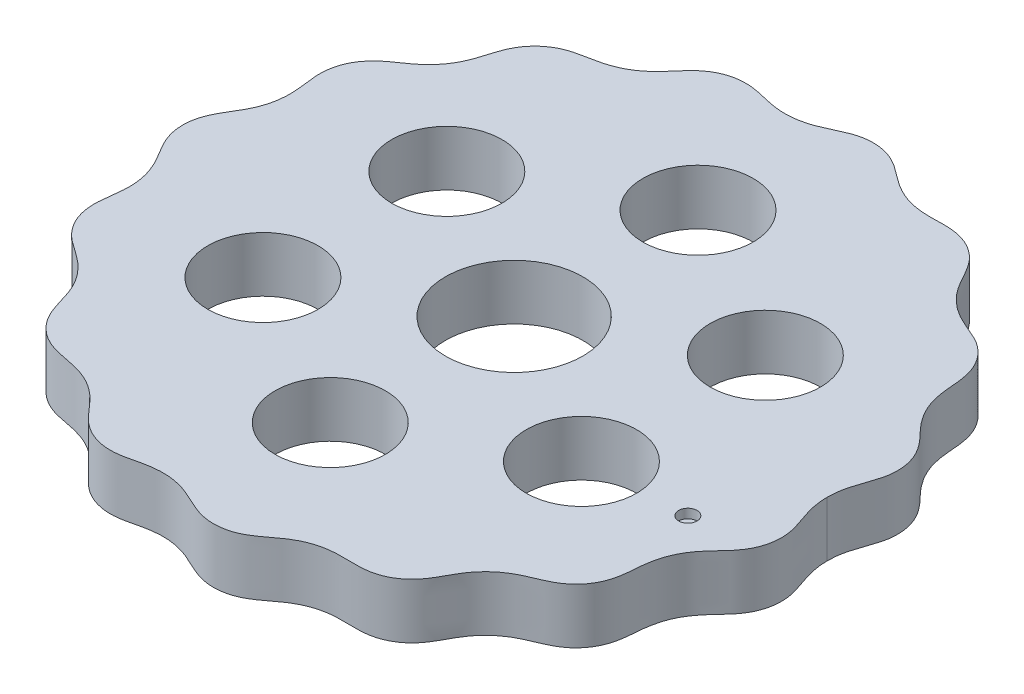
ISO-10303-21;
HEADER;
FILE_DESCRIPTION(('STEP AP214'),'2;1');
FILE_NAME('part.step','',(''),(''),'','','');
FILE_SCHEMA(('AUTOMOTIVE_DESIGN { 1 0 10303 214 1 1 1 1 }'));
ENDSEC;
DATA;
#1=APPLICATION_CONTEXT('core data for automotive mechanical design processes');
#2=APPLICATION_PROTOCOL_DEFINITION('international standard','automotive_design',2000,#1);
#3=PRODUCT_CONTEXT('',#1,'mechanical');
#4=PRODUCT('Part','Part','',(#3));
#5=PRODUCT_RELATED_PRODUCT_CATEGORY('part','',(#4));
#6=PRODUCT_DEFINITION_FORMATION('','',#4);
#7=PRODUCT_DEFINITION_CONTEXT('part definition',#1,'design');
#8=PRODUCT_DEFINITION('design','',#6,#7);
#9=PRODUCT_DEFINITION_SHAPE('','',#8);
#10=(LENGTH_UNIT() NAMED_UNIT(*) SI_UNIT(.MILLI.,.METRE.));
#11=(NAMED_UNIT(*) PLANE_ANGLE_UNIT() SI_UNIT($,.RADIAN.));
#12=(NAMED_UNIT(*) SI_UNIT($,.STERADIAN.) SOLID_ANGLE_UNIT());
#13=UNCERTAINTY_MEASURE_WITH_UNIT(LENGTH_MEASURE(1.E-05),#10,'distance_accuracy_value','');
#14=(GEOMETRIC_REPRESENTATION_CONTEXT(3) GLOBAL_UNCERTAINTY_ASSIGNED_CONTEXT((#13)) GLOBAL_UNIT_ASSIGNED_CONTEXT((#10,
#11,#12)) REPRESENTATION_CONTEXT('',''));
#15=CARTESIAN_POINT('',(0.,0.,0.));
#16=DIRECTION('',(0.,0.,1.));
#17=DIRECTION('',(1.,0.,0.));
#18=AXIS2_PLACEMENT_3D('',#15,#16,#17);
#19=CARTESIAN_POINT('',(-35.05,6.,-6.79447580960355E-13));
#20=CARTESIAN_POINT('',(-35.0500000000082,6.,0.601878761066767));
#21=CARTESIAN_POINT('',(-34.8553368029908,6.,1.81785079318405));
#22=CARTESIAN_POINT('',(-34.0120354721509,6.,3.43122980614223));
#23=CARTESIAN_POINT('',(-33.0335892363206,6.,4.93469078102037));
#24=CARTESIAN_POINT('',(-32.3517418708775,6.,6.59786117170244));
#25=CARTESIAN_POINT('',(-32.0757754971569,6.,8.37582766727421));
#26=CARTESIAN_POINT('',(-32.2049831799162,6.,10.1635179830055));
#27=CARTESIAN_POINT('',(-32.4979162012587,6.,11.9453935120308));
#28=CARTESIAN_POINT('',(-32.3457918337506,6.,13.7734509022175));
#29=CARTESIAN_POINT('',(-31.6155427163027,6.,15.4611393343524));
#30=CARTESIAN_POINT('',(-30.3879451238262,6.,16.8259176088963));
#31=CARTESIAN_POINT('',(-28.8726076271398,6.,17.8118803077543));
#32=CARTESIAN_POINT('',(-27.4434246094749,6.,18.8926486784884));
#33=CARTESIAN_POINT('',(-26.2849706751593,6.,20.269271473643));
#34=CARTESIAN_POINT('',(-25.4804410915177,6.,21.877479040722));
#35=CARTESIAN_POINT('',(-25.0056239563869,6.,23.6053486951235));
#36=CARTESIAN_POINT('',(-24.2011714079101,6.,25.8969589223933));
#37=CARTESIAN_POINT('',(-22.342794246026,6.,27.6504260297273));
#38=CARTESIAN_POINT('',(-19.9963563228629,6.,28.2983181895648));
#39=CARTESIAN_POINT('',(-18.2225137558597,6.,28.5671554070339));
#40=CARTESIAN_POINT('',(-16.5216437126037,6.,29.1475096030051));
#41=CARTESIAN_POINT('',(-15.0003772117141,6.,30.1081805796954));
#42=CARTESIAN_POINT('',(-13.7402024320431,6.,31.3837399153797));
#43=CARTESIAN_POINT('',(-12.6200769233239,6.,32.7974342125205));
#44=CARTESIAN_POINT('',(-11.1856343968467,6.,33.9385608734676));
#45=CARTESIAN_POINT('',(-9.45536171372532,6.,34.561863227018));
#46=CARTESIAN_POINT('',(-7.61907713212827,6.,34.6037655655048));
#47=CARTESIAN_POINT('',(-5.86627955103491,6.,34.1520112914151));
#48=CARTESIAN_POINT('',(-4.11223072361709,6.,33.789925987407));
#49=CARTESIAN_POINT('',(-2.3131542028763,6.,33.8221367498476));
#50=CARTESIAN_POINT('',(-0.572152538924218,6.,34.2736511028803));
#51=CARTESIAN_POINT('',(1.03579759565262,6.,35.0636998466422));
#52=CARTESIAN_POINT('',(2.70292921033807,6.,35.7895233494753));
#53=CARTESIAN_POINT('',(4.53328198678685,6.,35.9699050699175));
#54=CARTESIAN_POINT('',(6.32792326930641,6.,35.5664714343398));
#55=CARTESIAN_POINT('',(7.8873583875661,6.,34.6160917155494));
#56=CARTESIAN_POINT('',(9.27045661149057,6.,33.4702715747717));
#57=CARTESIAN_POINT('',(10.8258684579298,6.,32.571684343228));
#58=CARTESIAN_POINT('',(12.5497470426253,6.,32.056592442879));
#59=CARTESIAN_POINT('',(14.3403811437014,6.,31.9481438554672));
#60=CARTESIAN_POINT('',(16.138162859529,6.,32.0666998191716));
#61=CARTESIAN_POINT('',(17.9506188601929,6.,31.804064636253));
#62=CARTESIAN_POINT('',(19.5893345540055,6.,30.9697358445862));
#63=CARTESIAN_POINT('',(20.8793460191054,6.,29.6605139564718));
#64=CARTESIAN_POINT('',(21.7348969350553,6.,28.063477735684));
#65=CARTESIAN_POINT('',(22.9112517707044,6.,25.9835895461088));
#66=CARTESIAN_POINT('',(24.7570576623988,6.,24.3803877932754));
#67=CARTESIAN_POINT('',(26.9684972061444,6.,23.4758048940795));
#68=CARTESIAN_POINT('',(28.6321107295983,6.,22.7474902589853));
#69=CARTESIAN_POINT('',(30.0177309343962,6.,21.5384719803996));
#70=CARTESIAN_POINT('',(30.9526112904732,6.,19.9544631603976));
#71=CARTESIAN_POINT('',(31.3265352888142,6.,18.1655890312164));
#72=CARTESIAN_POINT('',(31.3965653967204,6.,16.3684571472859));
#73=CARTESIAN_POINT('',(31.7429571440484,6.,14.6069888472455));
#74=CARTESIAN_POINT('',(32.4877066627943,6.,12.9692487651538));
#75=CARTESIAN_POINT('',(33.5854700618532,6.,11.5493162041953));
#76=CARTESIAN_POINT('',(34.8762951439563,6.,10.2952756532867));
#77=CARTESIAN_POINT('',(35.9254904949993,6.,8.79622363953039));
#78=CARTESIAN_POINT('',(36.4395745060293,6.,7.03029588676672));
#79=CARTESIAN_POINT('',(36.3706563927939,6.,5.19330738123071));
#80=CARTESIAN_POINT('',(35.7745737883189,6.,3.47963326476361));
#81=CARTESIAN_POINT('',(35.1913465120437,6.,1.78711982704152));
#82=CARTESIAN_POINT('',(35.0499999999448,6.,0.59419871205814));
#83=CARTESIAN_POINT('',(35.05,6.,4.64495072061561E-12));
#84=B_SPLINE_CURVE_WITH_KNOTS('',3,(#19,#20,#21,#22,#23,#24,#25,#26,#27,#28,#29,#30,#31,#32,#33,
#34,#35,#36,#37,#38,#39,#40,#41,#42,#43,#44,#45,#46,#47,#48,#49,#50,#51,#52,#53,#54,#55,#56,#57,
#58,#59,#60,#61,#62,#63,#64,#65,#66,#67,#68,#69,#70,#71,#72,#73,#74,#75,#76,#77,#78,#79,#80,#81,
#82,#83),.UNSPECIFIED.,.F.,.F.,(4,1,1,1,1,1,1,1,1,1,1,1,1,1,1,1,1,1,1,1,1,1,1,1,1,1,1,1,1,1,1,1,
1,1,1,1,1,1,1,1,1,1,1,1,1,1,1,1,1,1,1,1,1,1,1,1,1,1,1,1,1,1,4),(0.0723695662334952,
0.0856649243269337,0.0989602824203721,0.112255640513811,0.125550998607249,0.138846356700688,
0.152141714794126,0.165437072887564,0.178732430981003,0.192027789074441,0.20532314716788,
0.218618505261318,0.231913863354757,0.245209221448195,0.258504579541634,0.271799937635072,
0.285095295728511,0.311686011915388,0.324981370008826,0.338276728102265,0.351572086195703,
0.364867444289141,0.37816280238258,0.391458160476018,0.404753518569457,0.418048876662895,
0.431344234756334,0.444639592849772,0.457934950943211,0.471230309036649,0.484525667130088,
0.497821025223526,0.511116383316965,0.524411741410403,0.537707099503842,0.55100245759728,
0.564297815690718,0.577593173784157,0.590888531877595,0.604183889971034,0.617479248064472,
0.630774606157911,0.644069964251349,0.657365322344788,0.670660680438226,0.683956038531665,
0.710546754718542,0.72384211281198,0.737137470905418,0.750432828998857,0.763728187092295,
0.777023545185734,0.790318903279172,0.803614261372611,0.816909619466049,0.830204977559488,
0.843500335652926,0.856795693746365,0.870091051839803,0.883386409933242,0.89668176802668,
0.909977126120118,0.923272484213557),.UNSPECIFIED.);
#85=DIRECTION('',(0.,-1.,0.));
#86=VECTOR('',#85,1.);
#87=SURFACE_OF_LINEAR_EXTRUSION('',#84,#86);
#88=CARTESIAN_POINT('',(-35.05,0.,-6.79447580960355E-13));
#89=CARTESIAN_POINT('',(-35.0500000000082,0.,0.601878761066767));
#90=CARTESIAN_POINT('',(-34.8553368029908,0.,1.81785079318405));
#91=CARTESIAN_POINT('',(-34.0120354721509,0.,3.43122980614223));
#92=CARTESIAN_POINT('',(-33.0335892363206,0.,4.93469078102037));
#93=CARTESIAN_POINT('',(-32.3517418708775,0.,6.59786117170244));
#94=CARTESIAN_POINT('',(-32.0757754971569,0.,8.37582766727421));
#95=CARTESIAN_POINT('',(-32.2049831799162,0.,10.1635179830055));
#96=CARTESIAN_POINT('',(-32.4979162012587,0.,11.9453935120308));
#97=CARTESIAN_POINT('',(-32.3457918337506,0.,13.7734509022175));
#98=CARTESIAN_POINT('',(-31.6155427163027,0.,15.4611393343524));
#99=CARTESIAN_POINT('',(-30.3879451238262,0.,16.8259176088963));
#100=CARTESIAN_POINT('',(-28.8726076271398,0.,17.8118803077543));
#101=CARTESIAN_POINT('',(-27.4434246094749,0.,18.8926486784884));
#102=CARTESIAN_POINT('',(-26.2849706751593,0.,20.269271473643));
#103=CARTESIAN_POINT('',(-25.4804410915177,0.,21.877479040722));
#104=CARTESIAN_POINT('',(-25.0056239563869,0.,23.6053486951235));
#105=CARTESIAN_POINT('',(-24.2011714079101,0.,25.8969589223933));
#106=CARTESIAN_POINT('',(-22.342794246026,0.,27.6504260297273));
#107=CARTESIAN_POINT('',(-19.9963563228629,0.,28.2983181895648));
#108=CARTESIAN_POINT('',(-18.2225137558597,0.,28.5671554070339));
#109=CARTESIAN_POINT('',(-16.5216437126037,0.,29.1475096030051));
#110=CARTESIAN_POINT('',(-15.0003772117141,0.,30.1081805796954));
#111=CARTESIAN_POINT('',(-13.7402024320431,0.,31.3837399153797));
#112=CARTESIAN_POINT('',(-12.6200769233239,0.,32.7974342125205));
#113=CARTESIAN_POINT('',(-11.1856343968467,0.,33.9385608734676));
#114=CARTESIAN_POINT('',(-9.45536171372532,0.,34.561863227018));
#115=CARTESIAN_POINT('',(-7.61907713212827,0.,34.6037655655048));
#116=CARTESIAN_POINT('',(-5.86627955103491,0.,34.1520112914151));
#117=CARTESIAN_POINT('',(-4.11223072361709,0.,33.789925987407));
#118=CARTESIAN_POINT('',(-2.3131542028763,0.,33.8221367498476));
#119=CARTESIAN_POINT('',(-0.572152538924218,0.,34.2736511028803));
#120=CARTESIAN_POINT('',(1.03579759565262,0.,35.0636998466422));
#121=CARTESIAN_POINT('',(2.70292921033807,0.,35.7895233494753));
#122=CARTESIAN_POINT('',(4.53328198678685,0.,35.9699050699175));
#123=CARTESIAN_POINT('',(6.32792326930641,0.,35.5664714343398));
#124=CARTESIAN_POINT('',(7.8873583875661,0.,34.6160917155494));
#125=CARTESIAN_POINT('',(9.27045661149057,0.,33.4702715747717));
#126=CARTESIAN_POINT('',(10.8258684579298,0.,32.571684343228));
#127=CARTESIAN_POINT('',(12.5497470426253,0.,32.056592442879));
#128=CARTESIAN_POINT('',(14.3403811437014,0.,31.9481438554672));
#129=CARTESIAN_POINT('',(16.138162859529,0.,32.0666998191716));
#130=CARTESIAN_POINT('',(17.9506188601929,0.,31.804064636253));
#131=CARTESIAN_POINT('',(19.5893345540055,0.,30.9697358445862));
#132=CARTESIAN_POINT('',(20.8793460191054,0.,29.6605139564718));
#133=CARTESIAN_POINT('',(21.7348969350553,0.,28.063477735684));
#134=CARTESIAN_POINT('',(22.9112517707044,0.,25.9835895461088));
#135=CARTESIAN_POINT('',(24.7570576623988,0.,24.3803877932754));
#136=CARTESIAN_POINT('',(26.9684972061444,0.,23.4758048940795));
#137=CARTESIAN_POINT('',(28.6321107295983,0.,22.7474902589853));
#138=CARTESIAN_POINT('',(30.0177309343962,0.,21.5384719803996));
#139=CARTESIAN_POINT('',(30.9526112904732,0.,19.9544631603976));
#140=CARTESIAN_POINT('',(31.3265352888142,0.,18.1655890312164));
#141=CARTESIAN_POINT('',(31.3965653967204,0.,16.3684571472859));
#142=CARTESIAN_POINT('',(31.7429571440484,0.,14.6069888472455));
#143=CARTESIAN_POINT('',(32.4877066627943,0.,12.9692487651538));
#144=CARTESIAN_POINT('',(33.5854700618532,0.,11.5493162041953));
#145=CARTESIAN_POINT('',(34.8762951439563,0.,10.2952756532867));
#146=CARTESIAN_POINT('',(35.9254904949993,0.,8.79622363953039));
#147=CARTESIAN_POINT('',(36.4395745060293,0.,7.03029588676672));
#148=CARTESIAN_POINT('',(36.3706563927939,0.,5.19330738123071));
#149=CARTESIAN_POINT('',(35.7745737883189,0.,3.47963326476361));
#150=CARTESIAN_POINT('',(35.1913465120437,0.,1.78711982704152));
#151=CARTESIAN_POINT('',(35.0499999999448,0.,0.59419871205814));
#152=CARTESIAN_POINT('',(35.05,0.,4.64495072061561E-12));
#153=B_SPLINE_CURVE_WITH_KNOTS('',3,(#88,#89,#90,#91,#92,#93,#94,#95,#96,#97,#98,#99,#100,#101,
#102,#103,#104,#105,#106,#107,#108,#109,#110,#111,#112,#113,#114,#115,#116,#117,#118,#119,#120,
#121,#122,#123,#124,#125,#126,#127,#128,#129,#130,#131,#132,#133,#134,#135,#136,#137,#138,#139,
#140,#141,#142,#143,#144,#145,#146,#147,#148,#149,#150,#151,#152),.UNSPECIFIED.,.F.,.F.,(4,1,1,
1,1,1,1,1,1,1,1,1,1,1,1,1,1,1,1,1,1,1,1,1,1,1,1,1,1,1,1,1,1,1,1,1,1,1,1,1,1,1,1,1,1,1,1,1,1,1,1,
1,1,1,1,1,1,1,1,1,1,1,4),(0.0723695662334952,0.0856649243269337,0.0989602824203721,
0.112255640513811,0.125550998607249,0.138846356700688,0.152141714794126,0.165437072887564,
0.178732430981003,0.192027789074441,0.20532314716788,0.218618505261318,0.231913863354757,
0.245209221448195,0.258504579541634,0.271799937635072,0.285095295728511,0.311686011915388,
0.324981370008826,0.338276728102265,0.351572086195703,0.364867444289141,0.37816280238258,
0.391458160476018,0.404753518569457,0.418048876662895,0.431344234756334,0.444639592849772,
0.457934950943211,0.471230309036649,0.484525667130088,0.497821025223526,0.511116383316965,
0.524411741410403,0.537707099503842,0.55100245759728,0.564297815690718,0.577593173784157,
0.590888531877595,0.604183889971034,0.617479248064472,0.630774606157911,0.644069964251349,
0.657365322344788,0.670660680438226,0.683956038531665,0.710546754718542,0.72384211281198,
0.737137470905418,0.750432828998857,0.763728187092295,0.777023545185734,0.790318903279172,
0.803614261372611,0.816909619466049,0.830204977559488,0.843500335652926,0.856795693746365,
0.870091051839803,0.883386409933242,0.89668176802668,0.909977126120118,0.923272484213557),.UNSPECIFIED.);
#154=CARTESIAN_POINT('',(-35.05,0.,1.36507195783586E-12));
#155=VERTEX_POINT('',#154);
#156=CARTESIAN_POINT('',(35.05,0.,-9.32696218690507E-12));
#157=VERTEX_POINT('',#156);
#158=EDGE_CURVE('E71',#155,#157,#153,.T.);
#159=ORIENTED_EDGE('',*,*,#158,.T.);
#160=DIRECTION('',(0.,-1.,0.));
#161=VECTOR('',#160,1.);
#162=CARTESIAN_POINT('',(35.05,6.,-9.32696218690507E-12));
#163=LINE('',#162,#161);
#164=CARTESIAN_POINT('',(35.05,6.,-9.32696218690507E-12));
#165=VERTEX_POINT('',#164);
#166=EDGE_CURVE('E11',#165,#157,#163,.T.);
#167=ORIENTED_EDGE('',*,*,#166,.F.);
#168=CARTESIAN_POINT('',(-35.05,6.,1.36507195783586E-12));
#169=VERTEX_POINT('',#168);
#170=EDGE_CURVE('E70',#169,#165,#84,.T.);
#171=ORIENTED_EDGE('',*,*,#170,.F.);
#172=DIRECTION('',(0.,-1.,0.));
#173=VECTOR('',#172,1.);
#174=CARTESIAN_POINT('',(-35.05,6.,1.36507195783586E-12));
#175=LINE('',#174,#173);
#176=EDGE_CURVE('E48',#169,#155,#175,.T.);
#177=ORIENTED_EDGE('',*,*,#176,.T.);
#178=EDGE_LOOP('',(#159,#167,#171,#177));
#179=FACE_BOUND('',#178,.T.);
#180=ADVANCED_FACE('F39',(#179),#87,.F.);
#181=CARTESIAN_POINT('',(35.05,6.,-9.32696218690507E-12));
#182=CARTESIAN_POINT('',(35.0499999998892,6.,-0.594198712220902));
#183=CARTESIAN_POINT('',(35.1913465120562,6.,-1.78711982767264));
#184=CARTESIAN_POINT('',(35.7745737882899,6.,-3.47963326521063));
#185=CARTESIAN_POINT('',(36.3706563927621,6.,-5.19330738173192));
#186=CARTESIAN_POINT('',(36.4395745059833,6.,-7.03029588725489));
#187=CARTESIAN_POINT('',(35.9254904949425,6.,-8.79622364001885));
#188=CARTESIAN_POINT('',(34.8762951438896,6.,-10.2952756537674));
#189=CARTESIAN_POINT('',(33.5854700617785,6.,-11.5493162046679));
#190=CARTESIAN_POINT('',(32.4877066627104,6.,-12.9692487656192));
#191=CARTESIAN_POINT('',(31.7429571439539,6.,-14.6069888477062));
#192=CARTESIAN_POINT('',(31.3965653966145,6.,-16.3684571477443));
#193=CARTESIAN_POINT('',(31.3265352886967,6.,-18.1655890316743));
#194=CARTESIAN_POINT('',(30.9526112903441,6.,-19.9544631608531));
#195=CARTESIAN_POINT('',(30.0177309342568,6.,-21.5384719808491));
#196=CARTESIAN_POINT('',(28.6321107294511,6.,-22.7474902594258));
#197=CARTESIAN_POINT('',(26.9684972059925,6.,-23.4758048945092));
#198=CARTESIAN_POINT('',(24.7570576622411,6.,-24.3803877936909));
#199=CARTESIAN_POINT('',(22.9112517705363,6.,-25.9835895465123));
#200=CARTESIAN_POINT('',(21.7348969348737,6.,-28.0634777360799));
#201=CARTESIAN_POINT('',(20.8793460189135,6.,-29.6605139568622));
#202=CARTESIAN_POINT('',(19.5893345538051,6.,-30.9697358449682));
#203=CARTESIAN_POINT('',(17.9506188599872,6.,-31.8040646366244));
#204=CARTESIAN_POINT('',(16.1381628593216,6.,-32.0666998195313));
#205=CARTESIAN_POINT('',(14.3403811434947,6.,-31.9481438558153));
#206=CARTESIAN_POINT('',(12.5497470424179,6.,-32.0565924432155));
#207=CARTESIAN_POINT('',(10.825868457719,6.,-32.5716843435534));
#208=CARTESIAN_POINT('',(9.27045661127405,6.,-33.470271575087));
#209=CARTESIAN_POINT('',(7.88735838734217,6.,-34.6160917158558));
#210=CARTESIAN_POINT('',(6.32792326907634,6.,-35.566471434636));
#211=CARTESIAN_POINT('',(4.53328198655416,6.,-35.9699050702021));
#212=CARTESIAN_POINT('',(2.70292921010655,6.,-35.7895233497481));
#213=CARTESIAN_POINT('',(1.0357975954258,6.,-35.0636998469043));
#214=CARTESIAN_POINT('',(-0.572152539145931,6.,-34.2736511031319));
#215=CARTESIAN_POINT('',(-2.3131542030951,6.,-33.822136750088));
#216=CARTESIAN_POINT('',(-4.11223072383567,6.,-33.7899259876357));
#217=CARTESIAN_POINT('',(-5.86627955125583,6.,-34.1520112916324));
#218=CARTESIAN_POINT('',(-7.61907713235212,6.,-34.6037655657108));
#219=CARTESIAN_POINT('',(-9.4553617139489,6.,-34.5618632272122));
#220=CARTESIAN_POINT('',(-11.1856343970663,6.,-33.9385608736506));
#221=CARTESIAN_POINT('',(-12.6200769235361,6.,-32.7974342126942));
#222=CARTESIAN_POINT('',(-13.7402024322461,6.,-31.3837399155461));
#223=CARTESIAN_POINT('',(-15.0003772119089,6.,-30.1081805798537));
#224=CARTESIAN_POINT('',(-16.5216437127923,6.,-29.1475096031536));
#225=CARTESIAN_POINT('',(-18.2225137560445,6.,-28.5671554071713));
#226=CARTESIAN_POINT('',(-19.996356323046,6.,-28.2983181896908));
#227=CARTESIAN_POINT('',(-22.3427942462048,6.,-27.6504260298381));
#228=CARTESIAN_POINT('',(-24.2011714080776,6.,-25.896958922492));
#229=CARTESIAN_POINT('',(-25.0056239565396,6.,-23.6053486952171));
#230=CARTESIAN_POINT('',(-25.4804410916592,6.,-21.8774790408125));
#231=CARTESIAN_POINT('',(-26.2849706752904,6.,-20.2692714737283));
#232=CARTESIAN_POINT('',(-27.4434246095971,6.,-18.8926486785662));
#233=CARTESIAN_POINT('',(-28.8726076272551,6.,-17.8118803078229));
#234=CARTESIAN_POINT('',(-30.3879451239351,6.,-16.825917608955));
#235=CARTESIAN_POINT('',(-31.6155427164027,6.,-15.4611393344032));
#236=CARTESIAN_POINT('',(-32.3457918338397,6.,-13.7734509022635));
#237=CARTESIAN_POINT('',(-32.497916201336,6.,-11.945393512076));
#238=CARTESIAN_POINT('',(-32.204983179982,6.,-10.1635179830524));
#239=CARTESIAN_POINT('',(-32.0757754972111,6.,-8.37582766732209));
#240=CARTESIAN_POINT('',(-32.3517418709203,6.,-6.59786117174831));
#241=CARTESIAN_POINT('',(-33.0335892363524,6.,-4.93469078106266));
#242=CARTESIAN_POINT('',(-34.0120354721736,6.,-3.43122980617509));
#243=CARTESIAN_POINT('',(-34.8553368030006,6.,-1.81785079322302));
#244=CARTESIAN_POINT('',(-35.0500000000164,6.,-0.601878761075716));
#245=CARTESIAN_POINT('',(-35.05,6.,1.36507195783586E-12));
#246=B_SPLINE_CURVE_WITH_KNOTS('',3,(#181,#182,#183,#184,#185,#186,#187,#188,#189,#190,#191,
#192,#193,#194,#195,#196,#197,#198,#199,#200,#201,#202,#203,#204,#205,#206,#207,#208,#209,#210,
#211,#212,#213,#214,#215,#216,#217,#218,#219,#220,#221,#222,#223,#224,#225,#226,#227,#228,#229,
#230,#231,#232,#233,#234,#235,#236,#237,#238,#239,#240,#241,#242,#243,#244,#245),.UNSPECIFIED.,
.F.,.F.,(4,1,1,1,1,1,1,1,1,1,1,1,1,1,1,1,1,1,1,1,1,1,1,1,1,1,1,1,1,1,1,1,1,1,1,1,1,1,1,1,1,1,1,
1,1,1,1,1,1,1,1,1,1,1,1,1,1,1,1,1,1,1,4),(0.0723695662334952,0.0856649243269337,
0.0989602824203721,0.112255640513811,0.125550998607249,0.138846356700688,0.152141714794126,
0.165437072887564,0.178732430981003,0.192027789074441,0.20532314716788,0.218618505261318,
0.231913863354757,0.245209221448195,0.258504579541634,0.271799937635072,0.285095295728511,
0.311686011915388,0.324981370008826,0.338276728102265,0.351572086195703,0.364867444289141,
0.37816280238258,0.391458160476018,0.404753518569457,0.418048876662895,0.431344234756334,
0.444639592849772,0.457934950943211,0.471230309036649,0.484525667130088,0.497821025223526,
0.511116383316965,0.524411741410403,0.537707099503842,0.55100245759728,0.564297815690718,
0.577593173784157,0.590888531877595,0.604183889971034,0.617479248064472,0.630774606157911,
0.644069964251349,0.657365322344788,0.670660680438226,0.683956038531665,0.710546754718541,
0.72384211281198,0.737137470905418,0.750432828998857,0.763728187092295,0.777023545185734,
0.790318903279172,0.803614261372611,0.816909619466049,0.830204977559488,0.843500335652926,
0.856795693746365,0.870091051839803,0.883386409933242,0.89668176802668,0.909977126120118,
0.923272484213557),.UNSPECIFIED.);
#247=DIRECTION('',(0.,-1.,0.));
#248=VECTOR('',#247,1.);
#249=SURFACE_OF_LINEAR_EXTRUSION('',#246,#248);
#250=CARTESIAN_POINT('',(35.05,0.,-9.32696218690507E-12));
#251=CARTESIAN_POINT('',(35.0499999998892,0.,-0.594198712220902));
#252=CARTESIAN_POINT('',(35.1913465120562,0.,-1.78711982767264));
#253=CARTESIAN_POINT('',(35.7745737882899,0.,-3.47963326521063));
#254=CARTESIAN_POINT('',(36.3706563927621,0.,-5.19330738173192));
#255=CARTESIAN_POINT('',(36.4395745059833,0.,-7.03029588725489));
#256=CARTESIAN_POINT('',(35.9254904949425,0.,-8.79622364001885));
#257=CARTESIAN_POINT('',(34.8762951438896,0.,-10.2952756537674));
#258=CARTESIAN_POINT('',(33.5854700617785,0.,-11.5493162046679));
#259=CARTESIAN_POINT('',(32.4877066627104,0.,-12.9692487656192));
#260=CARTESIAN_POINT('',(31.7429571439539,0.,-14.6069888477062));
#261=CARTESIAN_POINT('',(31.3965653966145,0.,-16.3684571477443));
#262=CARTESIAN_POINT('',(31.3265352886967,0.,-18.1655890316743));
#263=CARTESIAN_POINT('',(30.9526112903441,0.,-19.9544631608531));
#264=CARTESIAN_POINT('',(30.0177309342568,0.,-21.5384719808491));
#265=CARTESIAN_POINT('',(28.6321107294511,0.,-22.7474902594258));
#266=CARTESIAN_POINT('',(26.9684972059925,0.,-23.4758048945092));
#267=CARTESIAN_POINT('',(24.7570576622411,0.,-24.3803877936909));
#268=CARTESIAN_POINT('',(22.9112517705363,0.,-25.9835895465123));
#269=CARTESIAN_POINT('',(21.7348969348737,0.,-28.0634777360799));
#270=CARTESIAN_POINT('',(20.8793460189135,0.,-29.6605139568622));
#271=CARTESIAN_POINT('',(19.5893345538051,0.,-30.9697358449682));
#272=CARTESIAN_POINT('',(17.9506188599872,0.,-31.8040646366244));
#273=CARTESIAN_POINT('',(16.1381628593216,0.,-32.0666998195313));
#274=CARTESIAN_POINT('',(14.3403811434947,0.,-31.9481438558153));
#275=CARTESIAN_POINT('',(12.5497470424179,0.,-32.0565924432155));
#276=CARTESIAN_POINT('',(10.825868457719,0.,-32.5716843435534));
#277=CARTESIAN_POINT('',(9.27045661127405,0.,-33.470271575087));
#278=CARTESIAN_POINT('',(7.88735838734217,0.,-34.6160917158558));
#279=CARTESIAN_POINT('',(6.32792326907634,0.,-35.566471434636));
#280=CARTESIAN_POINT('',(4.53328198655416,0.,-35.9699050702021));
#281=CARTESIAN_POINT('',(2.70292921010655,0.,-35.7895233497481));
#282=CARTESIAN_POINT('',(1.0357975954258,0.,-35.0636998469043));
#283=CARTESIAN_POINT('',(-0.572152539145931,0.,-34.2736511031319));
#284=CARTESIAN_POINT('',(-2.3131542030951,0.,-33.822136750088));
#285=CARTESIAN_POINT('',(-4.11223072383567,0.,-33.7899259876357));
#286=CARTESIAN_POINT('',(-5.86627955125583,0.,-34.1520112916324));
#287=CARTESIAN_POINT('',(-7.61907713235212,0.,-34.6037655657108));
#288=CARTESIAN_POINT('',(-9.4553617139489,0.,-34.5618632272122));
#289=CARTESIAN_POINT('',(-11.1856343970663,0.,-33.9385608736506));
#290=CARTESIAN_POINT('',(-12.6200769235361,0.,-32.7974342126942));
#291=CARTESIAN_POINT('',(-13.7402024322461,0.,-31.3837399155461));
#292=CARTESIAN_POINT('',(-15.0003772119089,0.,-30.1081805798537));
#293=CARTESIAN_POINT('',(-16.5216437127923,0.,-29.1475096031536));
#294=CARTESIAN_POINT('',(-18.2225137560445,0.,-28.5671554071713));
#295=CARTESIAN_POINT('',(-19.996356323046,0.,-28.2983181896908));
#296=CARTESIAN_POINT('',(-22.3427942462048,0.,-27.6504260298381));
#297=CARTESIAN_POINT('',(-24.2011714080776,0.,-25.896958922492));
#298=CARTESIAN_POINT('',(-25.0056239565396,0.,-23.6053486952171));
#299=CARTESIAN_POINT('',(-25.4804410916592,0.,-21.8774790408125));
#300=CARTESIAN_POINT('',(-26.2849706752904,0.,-20.2692714737283));
#301=CARTESIAN_POINT('',(-27.4434246095971,0.,-18.8926486785662));
#302=CARTESIAN_POINT('',(-28.8726076272551,0.,-17.8118803078229));
#303=CARTESIAN_POINT('',(-30.3879451239351,0.,-16.825917608955));
#304=CARTESIAN_POINT('',(-31.6155427164027,0.,-15.4611393344032));
#305=CARTESIAN_POINT('',(-32.3457918338397,0.,-13.7734509022635));
#306=CARTESIAN_POINT('',(-32.497916201336,0.,-11.945393512076));
#307=CARTESIAN_POINT('',(-32.204983179982,0.,-10.1635179830524));
#308=CARTESIAN_POINT('',(-32.0757754972111,0.,-8.37582766732209));
#309=CARTESIAN_POINT('',(-32.3517418709203,0.,-6.59786117174831));
#310=CARTESIAN_POINT('',(-33.0335892363524,0.,-4.93469078106266));
#311=CARTESIAN_POINT('',(-34.0120354721736,0.,-3.43122980617509));
#312=CARTESIAN_POINT('',(-34.8553368030006,0.,-1.81785079322302));
#313=CARTESIAN_POINT('',(-35.0500000000164,0.,-0.601878761075716));
#314=CARTESIAN_POINT('',(-35.05,0.,1.36507195783586E-12));
#315=B_SPLINE_CURVE_WITH_KNOTS('',3,(#250,#251,#252,#253,#254,#255,#256,#257,#258,#259,#260,
#261,#262,#263,#264,#265,#266,#267,#268,#269,#270,#271,#272,#273,#274,#275,#276,#277,#278,#279,
#280,#281,#282,#283,#284,#285,#286,#287,#288,#289,#290,#291,#292,#293,#294,#295,#296,#297,#298,
#299,#300,#301,#302,#303,#304,#305,#306,#307,#308,#309,#310,#311,#312,#313,#314),.UNSPECIFIED.,
.F.,.F.,(4,1,1,1,1,1,1,1,1,1,1,1,1,1,1,1,1,1,1,1,1,1,1,1,1,1,1,1,1,1,1,1,1,1,1,1,1,1,1,1,1,1,1,
1,1,1,1,1,1,1,1,1,1,1,1,1,1,1,1,1,1,1,4),(0.0723695662334952,0.0856649243269337,
0.0989602824203721,0.112255640513811,0.125550998607249,0.138846356700688,0.152141714794126,
0.165437072887564,0.178732430981003,0.192027789074441,0.20532314716788,0.218618505261318,
0.231913863354757,0.245209221448195,0.258504579541634,0.271799937635072,0.285095295728511,
0.311686011915388,0.324981370008826,0.338276728102265,0.351572086195703,0.364867444289141,
0.37816280238258,0.391458160476018,0.404753518569457,0.418048876662895,0.431344234756334,
0.444639592849772,0.457934950943211,0.471230309036649,0.484525667130088,0.497821025223526,
0.511116383316965,0.524411741410403,0.537707099503842,0.55100245759728,0.564297815690718,
0.577593173784157,0.590888531877595,0.604183889971034,0.617479248064472,0.630774606157911,
0.644069964251349,0.657365322344788,0.670660680438226,0.683956038531665,0.710546754718541,
0.72384211281198,0.737137470905418,0.750432828998857,0.763728187092295,0.777023545185734,
0.790318903279172,0.803614261372611,0.816909619466049,0.830204977559488,0.843500335652926,
0.856795693746365,0.870091051839803,0.883386409933242,0.89668176802668,0.909977126120118,
0.923272484213557),.UNSPECIFIED.);
#316=EDGE_CURVE('E63',#157,#155,#315,.T.);
#317=ORIENTED_EDGE('',*,*,#316,.T.);
#318=ORIENTED_EDGE('',*,*,#176,.F.);
#319=EDGE_CURVE('E55',#165,#169,#246,.T.);
#320=ORIENTED_EDGE('',*,*,#319,.F.);
#321=ORIENTED_EDGE('',*,*,#166,.T.);
#322=EDGE_LOOP('',(#317,#318,#320,#321));
#323=FACE_BOUND('',#322,.T.);
#324=ADVANCED_FACE('F66',(#323),#249,.F.);
#325=CARTESIAN_POINT('',(1.04566117567072,6.,35.0529956398208));
#326=DIRECTION('',(0.,-1.,0.));
#327=DIRECTION('',(0.,0.,-1.));
#328=AXIS2_PLACEMENT_3D('',#325,#326,#327);
#329=PLANE('',#328);
#330=CARTESIAN_POINT('',(29.2200048934011,6.,9.32717297087158));
#331=DIRECTION('',(0.,1.,0.));
#332=DIRECTION('',(0.,0.,1.));
#333=AXIS2_PLACEMENT_3D('',#330,#331,#332);
#334=CIRCLE('',#333,1.);
#335=CARTESIAN_POINT('',(29.2200048934011,6.,10.3271729708716));
#336=VERTEX_POINT('',#335);
#337=EDGE_CURVE('E228',#336,#336,#334,.T.);
#338=ORIENTED_EDGE('',*,*,#337,.F.);
#339=EDGE_LOOP('',(#338));
#340=FACE_BOUND('',#339,.T.);
#341=CARTESIAN_POINT('',(-16.3205080756888,6.,-10.));
#342=DIRECTION('',(0.,1.,0.));
#343=DIRECTION('',(0.,0.,1.));
#344=AXIS2_PLACEMENT_3D('',#341,#342,#343);
#345=CIRCLE('',#344,6.);
#346=CARTESIAN_POINT('',(-16.3205080756888,6.,-4.));
#347=VERTEX_POINT('',#346);
#348=EDGE_CURVE('E231',#347,#347,#345,.T.);
#349=ORIENTED_EDGE('',*,*,#348,.F.);
#350=EDGE_LOOP('',(#349));
#351=FACE_BOUND('',#350,.T.);
#352=CARTESIAN_POINT('',(-16.3205080756888,6.,10.));
#353=DIRECTION('',(0.,1.,0.));
#354=DIRECTION('',(0.,0.,1.));
#355=AXIS2_PLACEMENT_3D('',#352,#353,#354);
#356=CIRCLE('',#355,6.);
#357=CARTESIAN_POINT('',(-16.3205080756888,6.,16.));
#358=VERTEX_POINT('',#357);
#359=EDGE_CURVE('E260',#358,#358,#356,.T.);
#360=ORIENTED_EDGE('',*,*,#359,.F.);
#361=EDGE_LOOP('',(#360));
#362=FACE_BOUND('',#361,.T.);
#363=CARTESIAN_POINT('',(1.,6.,20.));
#364=DIRECTION('',(0.,1.,0.));
#365=DIRECTION('',(0.,0.,1.));
#366=AXIS2_PLACEMENT_3D('',#363,#364,#365);
#367=CIRCLE('',#366,6.00000000000001);
#368=CARTESIAN_POINT('',(1.,6.,26.));
#369=VERTEX_POINT('',#368);
#370=EDGE_CURVE('E254',#369,#369,#367,.T.);
#371=ORIENTED_EDGE('',*,*,#370,.F.);
#372=EDGE_LOOP('',(#371));
#373=FACE_BOUND('',#372,.T.);
#374=CARTESIAN_POINT('',(18.3205080756888,6.,10.));
#375=DIRECTION('',(0.,1.,0.));
#376=DIRECTION('',(0.,0.,1.));
#377=AXIS2_PLACEMENT_3D('',#374,#375,#376);
#378=CIRCLE('',#377,6.00000000000001);
#379=CARTESIAN_POINT('',(18.3205080756888,6.,16.));
#380=VERTEX_POINT('',#379);
#381=EDGE_CURVE('E248',#380,#380,#378,.T.);
#382=ORIENTED_EDGE('',*,*,#381,.F.);
#383=EDGE_LOOP('',(#382));
#384=FACE_BOUND('',#383,.T.);
#385=CARTESIAN_POINT('',(18.3205080756888,6.,-10.));
#386=DIRECTION('',(0.,1.,0.));
#387=DIRECTION('',(0.,0.,1.));
#388=AXIS2_PLACEMENT_3D('',#385,#386,#387);
#389=CIRCLE('',#388,6.);
#390=CARTESIAN_POINT('',(18.3205080756888,6.,-4.));
#391=VERTEX_POINT('',#390);
#392=EDGE_CURVE('E242',#391,#391,#389,.T.);
#393=ORIENTED_EDGE('',*,*,#392,.F.);
#394=EDGE_LOOP('',(#393));
#395=FACE_BOUND('',#394,.T.);
#396=CARTESIAN_POINT('',(0.999999999999997,6.,-20.));
#397=DIRECTION('',(0.,1.,0.));
#398=DIRECTION('',(0.,0.,1.));
#399=AXIS2_PLACEMENT_3D('',#396,#397,#398);
#400=CIRCLE('',#399,6.);
#401=CARTESIAN_POINT('',(0.999999999999997,6.,-14.));
#402=VERTEX_POINT('',#401);
#403=EDGE_CURVE('E236',#402,#402,#400,.T.);
#404=ORIENTED_EDGE('',*,*,#403,.F.);
#405=EDGE_LOOP('',(#404));
#406=FACE_BOUND('',#405,.T.);
#407=CARTESIAN_POINT('',(0.999999999999997,6.,0.));
#408=DIRECTION('',(0.,1.,0.));
#409=DIRECTION('',(0.,0.,1.));
#410=AXIS2_PLACEMENT_3D('',#407,#408,#409);
#411=CIRCLE('',#410,7.475);
#412=CARTESIAN_POINT('',(0.999999999999997,6.,7.475));
#413=VERTEX_POINT('',#412);
#414=EDGE_CURVE('E78',#413,#413,#411,.T.);
#415=ORIENTED_EDGE('',*,*,#414,.F.);
#416=EDGE_LOOP('',(#415));
#417=FACE_BOUND('',#416,.T.);
#418=ORIENTED_EDGE('',*,*,#170,.T.);
#419=ORIENTED_EDGE('',*,*,#319,.T.);
#420=EDGE_LOOP('',(#418,#419));
#421=FACE_BOUND('',#420,.T.);
#422=ADVANCED_FACE('F103',(#340,#351,#362,#373,#384,#395,#406,#417,#421),#329,.F.);
#423=CARTESIAN_POINT('',(1.04566117567072,0.,35.0529956398208));
#424=DIRECTION('',(0.,-1.,0.));
#425=DIRECTION('',(0.,0.,-1.));
#426=AXIS2_PLACEMENT_3D('',#423,#424,#425);
#427=PLANE('',#426);
#428=CARTESIAN_POINT('',(-16.3205080756888,0.,-10.));
#429=DIRECTION('',(0.,1.,0.));
#430=DIRECTION('',(0.,0.,1.));
#431=AXIS2_PLACEMENT_3D('',#428,#429,#430);
#432=CIRCLE('',#431,6.);
#433=CARTESIAN_POINT('',(-16.3205080756888,0.,-4.));
#434=VERTEX_POINT('',#433);
#435=EDGE_CURVE('E227',#434,#434,#432,.T.);
#436=ORIENTED_EDGE('',*,*,#435,.T.);
#437=EDGE_LOOP('',(#436));
#438=FACE_BOUND('',#437,.T.);
#439=CARTESIAN_POINT('',(-16.3205080756888,0.,10.));
#440=DIRECTION('',(0.,1.,0.));
#441=DIRECTION('',(0.,0.,1.));
#442=AXIS2_PLACEMENT_3D('',#439,#440,#441);
#443=CIRCLE('',#442,6.);
#444=CARTESIAN_POINT('',(-16.3205080756888,0.,16.));
#445=VERTEX_POINT('',#444);
#446=EDGE_CURVE('E263',#445,#445,#443,.T.);
#447=ORIENTED_EDGE('',*,*,#446,.T.);
#448=EDGE_LOOP('',(#447));
#449=FACE_BOUND('',#448,.T.);
#450=CARTESIAN_POINT('',(1.,0.,20.));
#451=DIRECTION('',(0.,1.,0.));
#452=DIRECTION('',(0.,0.,1.));
#453=AXIS2_PLACEMENT_3D('',#450,#451,#452);
#454=CIRCLE('',#453,6.00000000000001);
#455=CARTESIAN_POINT('',(1.,0.,26.));
#456=VERTEX_POINT('',#455);
#457=EDGE_CURVE('E257',#456,#456,#454,.T.);
#458=ORIENTED_EDGE('',*,*,#457,.T.);
#459=EDGE_LOOP('',(#458));
#460=FACE_BOUND('',#459,.T.);
#461=CARTESIAN_POINT('',(18.3205080756888,0.,10.));
#462=DIRECTION('',(0.,1.,0.));
#463=DIRECTION('',(0.,0.,1.));
#464=AXIS2_PLACEMENT_3D('',#461,#462,#463);
#465=CIRCLE('',#464,6.00000000000001);
#466=CARTESIAN_POINT('',(18.3205080756888,0.,16.));
#467=VERTEX_POINT('',#466);
#468=EDGE_CURVE('E251',#467,#467,#465,.T.);
#469=ORIENTED_EDGE('',*,*,#468,.T.);
#470=EDGE_LOOP('',(#469));
#471=FACE_BOUND('',#470,.T.);
#472=CARTESIAN_POINT('',(18.3205080756888,0.,-10.));
#473=DIRECTION('',(0.,1.,0.));
#474=DIRECTION('',(0.,0.,1.));
#475=AXIS2_PLACEMENT_3D('',#472,#473,#474);
#476=CIRCLE('',#475,6.);
#477=CARTESIAN_POINT('',(18.3205080756888,0.,-4.));
#478=VERTEX_POINT('',#477);
#479=EDGE_CURVE('E245',#478,#478,#476,.T.);
#480=ORIENTED_EDGE('',*,*,#479,.T.);
#481=EDGE_LOOP('',(#480));
#482=FACE_BOUND('',#481,.T.);
#483=CARTESIAN_POINT('',(0.999999999999997,0.,-20.));
#484=DIRECTION('',(0.,1.,0.));
#485=DIRECTION('',(0.,0.,1.));
#486=AXIS2_PLACEMENT_3D('',#483,#484,#485);
#487=CIRCLE('',#486,6.);
#488=CARTESIAN_POINT('',(0.999999999999997,0.,-14.));
#489=VERTEX_POINT('',#488);
#490=EDGE_CURVE('E239',#489,#489,#487,.T.);
#491=ORIENTED_EDGE('',*,*,#490,.T.);
#492=EDGE_LOOP('',(#491));
#493=FACE_BOUND('',#492,.T.);
#494=CARTESIAN_POINT('',(0.999999999999997,0.,0.));
#495=DIRECTION('',(0.,1.,0.));
#496=DIRECTION('',(0.,0.,1.));
#497=AXIS2_PLACEMENT_3D('',#494,#495,#496);
#498=CIRCLE('',#497,7.475);
#499=CARTESIAN_POINT('',(0.999999999999997,0.,7.475));
#500=VERTEX_POINT('',#499);
#501=EDGE_CURVE('E75',#500,#500,#498,.T.);
#502=ORIENTED_EDGE('',*,*,#501,.T.);
#503=EDGE_LOOP('',(#502));
#504=FACE_BOUND('',#503,.T.);
#505=ORIENTED_EDGE('',*,*,#158,.F.);
#506=ORIENTED_EDGE('',*,*,#316,.F.);
#507=EDGE_LOOP('',(#505,#506));
#508=FACE_BOUND('',#507,.T.);
#509=ADVANCED_FACE('F74',(#438,#449,#460,#471,#482,#493,#504,#508),#427,.T.);
#510=CARTESIAN_POINT('',(0.999999999999997,0.,0.));
#511=DIRECTION('',(0.,1.,0.));
#512=DIRECTION('',(0.,0.,1.));
#513=AXIS2_PLACEMENT_3D('',#510,#511,#512);
#514=CYLINDRICAL_SURFACE('',#513,7.475);
#515=ORIENTED_EDGE('',*,*,#501,.F.);
#516=EDGE_LOOP('',(#515));
#517=FACE_BOUND('',#516,.T.);
#518=ORIENTED_EDGE('',*,*,#414,.T.);
#519=EDGE_LOOP('',(#518));
#520=FACE_BOUND('',#519,.T.);
#521=ADVANCED_FACE('F106',(#517,#520),#514,.F.);
#522=CARTESIAN_POINT('',(0.999999999999997,0.,-20.));
#523=DIRECTION('',(0.,1.,0.));
#524=DIRECTION('',(0.,0.,1.));
#525=AXIS2_PLACEMENT_3D('',#522,#523,#524);
#526=CYLINDRICAL_SURFACE('',#525,6.);
#527=ORIENTED_EDGE('',*,*,#490,.F.);
#528=EDGE_LOOP('',(#527));
#529=FACE_BOUND('',#528,.T.);
#530=ORIENTED_EDGE('',*,*,#403,.T.);
#531=EDGE_LOOP('',(#530));
#532=FACE_BOUND('',#531,.T.);
#533=ADVANCED_FACE('F113',(#529,#532),#526,.F.);
#534=CARTESIAN_POINT('',(18.3205080756888,0.,-10.));
#535=DIRECTION('',(0.,1.,0.));
#536=DIRECTION('',(0.,0.,1.));
#537=AXIS2_PLACEMENT_3D('',#534,#535,#536);
#538=CYLINDRICAL_SURFACE('',#537,6.);
#539=ORIENTED_EDGE('',*,*,#479,.F.);
#540=EDGE_LOOP('',(#539));
#541=FACE_BOUND('',#540,.T.);
#542=ORIENTED_EDGE('',*,*,#392,.T.);
#543=EDGE_LOOP('',(#542));
#544=FACE_BOUND('',#543,.T.);
#545=ADVANCED_FACE('F131',(#541,#544),#538,.F.);
#546=CARTESIAN_POINT('',(18.3205080756888,0.,10.));
#547=DIRECTION('',(0.,1.,0.));
#548=DIRECTION('',(0.,0.,1.));
#549=AXIS2_PLACEMENT_3D('',#546,#547,#548);
#550=CYLINDRICAL_SURFACE('',#549,6.00000000000001);
#551=ORIENTED_EDGE('',*,*,#468,.F.);
#552=EDGE_LOOP('',(#551));
#553=FACE_BOUND('',#552,.T.);
#554=ORIENTED_EDGE('',*,*,#381,.T.);
#555=EDGE_LOOP('',(#554));
#556=FACE_BOUND('',#555,.T.);
#557=ADVANCED_FACE('F127',(#553,#556),#550,.F.);
#558=CARTESIAN_POINT('',(1.,0.,20.));
#559=DIRECTION('',(0.,1.,0.));
#560=DIRECTION('',(0.,0.,1.));
#561=AXIS2_PLACEMENT_3D('',#558,#559,#560);
#562=CYLINDRICAL_SURFACE('',#561,6.00000000000001);
#563=ORIENTED_EDGE('',*,*,#457,.F.);
#564=EDGE_LOOP('',(#563));
#565=FACE_BOUND('',#564,.T.);
#566=ORIENTED_EDGE('',*,*,#370,.T.);
#567=EDGE_LOOP('',(#566));
#568=FACE_BOUND('',#567,.T.);
#569=ADVANCED_FACE('F123',(#565,#568),#562,.F.);
#570=CARTESIAN_POINT('',(-16.3205080756888,0.,10.));
#571=DIRECTION('',(0.,1.,0.));
#572=DIRECTION('',(0.,0.,1.));
#573=AXIS2_PLACEMENT_3D('',#570,#571,#572);
#574=CYLINDRICAL_SURFACE('',#573,6.);
#575=ORIENTED_EDGE('',*,*,#446,.F.);
#576=EDGE_LOOP('',(#575));
#577=FACE_BOUND('',#576,.T.);
#578=ORIENTED_EDGE('',*,*,#359,.T.);
#579=EDGE_LOOP('',(#578));
#580=FACE_BOUND('',#579,.T.);
#581=ADVANCED_FACE('F119',(#577,#580),#574,.F.);
#582=CARTESIAN_POINT('',(-16.3205080756888,0.,-10.));
#583=DIRECTION('',(0.,1.,0.));
#584=DIRECTION('',(0.,0.,1.));
#585=AXIS2_PLACEMENT_3D('',#582,#583,#584);
#586=CYLINDRICAL_SURFACE('',#585,6.);
#587=ORIENTED_EDGE('',*,*,#435,.F.);
#588=EDGE_LOOP('',(#587));
#589=FACE_BOUND('',#588,.T.);
#590=ORIENTED_EDGE('',*,*,#348,.T.);
#591=EDGE_LOOP('',(#590));
#592=FACE_BOUND('',#591,.T.);
#593=ADVANCED_FACE('F115',(#589,#592),#586,.F.);
#594=CARTESIAN_POINT('',(29.2200048934011,5.,9.32717297087158));
#595=DIRECTION('',(0.,1.,0.));
#596=DIRECTION('',(0.,0.,1.));
#597=AXIS2_PLACEMENT_3D('',#594,#595,#596);
#598=CYLINDRICAL_SURFACE('',#597,1.);
#599=CARTESIAN_POINT('',(29.2200048934011,5.,9.32717297087158));
#600=DIRECTION('',(0.,1.,0.));
#601=DIRECTION('',(0.,0.,1.));
#602=AXIS2_PLACEMENT_3D('',#599,#600,#601);
#603=CIRCLE('',#602,1.);
#604=CARTESIAN_POINT('',(29.2200048934011,5.,10.3271729708716));
#605=VERTEX_POINT('',#604);
#606=EDGE_CURVE('E226',#605,#605,#603,.T.);
#607=ORIENTED_EDGE('',*,*,#606,.F.);
#608=EDGE_LOOP('',(#607));
#609=FACE_BOUND('',#608,.T.);
#610=ORIENTED_EDGE('',*,*,#337,.T.);
#611=EDGE_LOOP('',(#610));
#612=FACE_BOUND('',#611,.T.);
#613=ADVANCED_FACE('F118',(#609,#612),#598,.F.);
#614=CARTESIAN_POINT('',(29.2200048934011,5.,9.32717297087158));
#615=DIRECTION('',(0.,1.,0.));
#616=DIRECTION('',(0.,0.,1.));
#617=AXIS2_PLACEMENT_3D('',#614,#615,#616);
#618=PLANE('',#617);
#619=ORIENTED_EDGE('',*,*,#606,.T.);
#620=EDGE_LOOP('',(#619));
#621=FACE_BOUND('',#620,.T.);
#622=ADVANCED_FACE('F141',(#621),#618,.T.);
#623=CLOSED_SHELL('',(#180,#324,#422,#509,#521,#533,#545,#557,#569,#581,#593,#613,#622));
#624=MANIFOLD_SOLID_BREP('B2',#623);
#625=ADVANCED_BREP_SHAPE_REPRESENTATION('',(#18,#624),#14);
#626=SHAPE_DEFINITION_REPRESENTATION(#9,#625);
ENDSEC;
END-ISO-10303-21;
